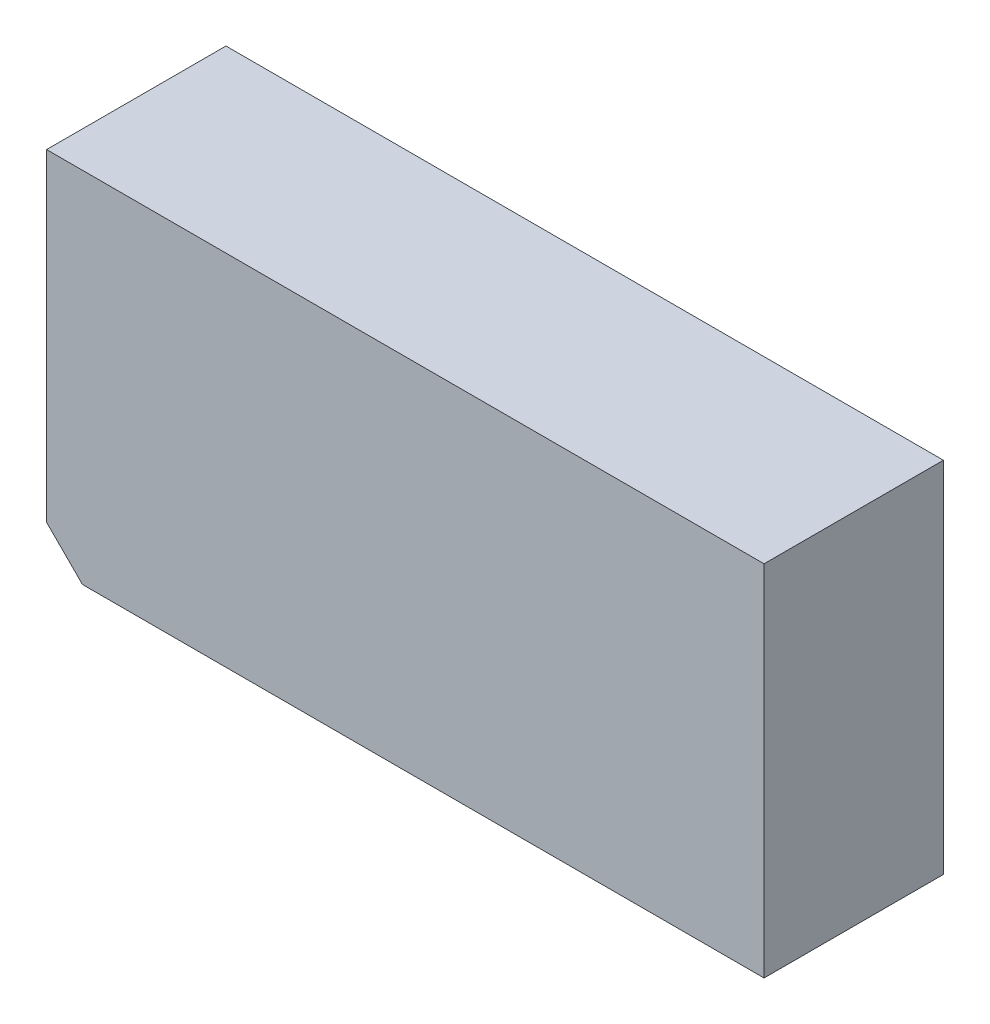
ISO-10303-21;
HEADER;
FILE_DESCRIPTION(('STEP AP214'),'2;1');
FILE_NAME('part.step','',(''),(''),'','','');
FILE_SCHEMA(('AUTOMOTIVE_DESIGN { 1 0 10303 214 1 1 1 1 }'));
ENDSEC;
DATA;
#1=APPLICATION_CONTEXT('core data for automotive mechanical design processes');
#2=APPLICATION_PROTOCOL_DEFINITION('international standard','automotive_design',2000,#1);
#3=PRODUCT_CONTEXT('',#1,'mechanical');
#4=PRODUCT('Part','Part','',(#3));
#5=PRODUCT_RELATED_PRODUCT_CATEGORY('part','',(#4));
#6=PRODUCT_DEFINITION_FORMATION('','',#4);
#7=PRODUCT_DEFINITION_CONTEXT('part definition',#1,'design');
#8=PRODUCT_DEFINITION('design','',#6,#7);
#9=PRODUCT_DEFINITION_SHAPE('','',#8);
#10=(LENGTH_UNIT() NAMED_UNIT(*) SI_UNIT(.MILLI.,.METRE.));
#11=(NAMED_UNIT(*) PLANE_ANGLE_UNIT() SI_UNIT($,.RADIAN.));
#12=(NAMED_UNIT(*) SI_UNIT($,.STERADIAN.) SOLID_ANGLE_UNIT());
#13=UNCERTAINTY_MEASURE_WITH_UNIT(LENGTH_MEASURE(1.E-05),#10,'distance_accuracy_value','');
#14=(GEOMETRIC_REPRESENTATION_CONTEXT(3) GLOBAL_UNCERTAINTY_ASSIGNED_CONTEXT((#13)) GLOBAL_UNIT_ASSIGNED_CONTEXT((#10,
#11,#12)) REPRESENTATION_CONTEXT('',''));
#15=CARTESIAN_POINT('',(0.,0.,0.));
#16=DIRECTION('',(0.,0.,1.));
#17=DIRECTION('',(1.,0.,0.));
#18=AXIS2_PLACEMENT_3D('',#15,#16,#17);
#19=CARTESIAN_POINT('',(0.,20.,10.));
#20=DIRECTION('',(1.,0.,0.));
#21=DIRECTION('',(0.,0.,-1.));
#22=AXIS2_PLACEMENT_3D('',#19,#20,#21);
#23=PLANE('',#22);
#24=DIRECTION('',(0.,-1.,0.));
#25=VECTOR('',#24,1.);
#26=CARTESIAN_POINT('',(0.,20.,0.));
#27=LINE('',#26,#25);
#28=CARTESIAN_POINT('',(0.,20.,0.));
#29=VERTEX_POINT('',#28);
#30=CARTESIAN_POINT('',(0.,2.00000000000001,0.));
#31=VERTEX_POINT('',#30);
#32=EDGE_CURVE('E120',#29,#31,#27,.T.);
#33=ORIENTED_EDGE('',*,*,#32,.T.);
#34=DIRECTION('',(0.,0.,1.));
#35=VECTOR('',#34,1.);
#36=CARTESIAN_POINT('',(0.,2.00000000000001,10.));
#37=LINE('',#36,#35);
#38=CARTESIAN_POINT('',(0.,2.00000000000001,10.));
#39=VERTEX_POINT('',#38);
#40=EDGE_CURVE('E52',#31,#39,#37,.T.);
#41=ORIENTED_EDGE('',*,*,#40,.T.);
#42=DIRECTION('',(0.,-1.,0.));
#43=VECTOR('',#42,1.);
#44=CARTESIAN_POINT('',(0.,20.,10.));
#45=LINE('',#44,#43);
#46=CARTESIAN_POINT('',(0.,20.,10.));
#47=VERTEX_POINT('',#46);
#48=EDGE_CURVE('E100',#47,#39,#45,.T.);
#49=ORIENTED_EDGE('',*,*,#48,.F.);
#50=DIRECTION('',(0.,0.,-1.));
#51=VECTOR('',#50,1.);
#52=CARTESIAN_POINT('',(0.,20.,10.));
#53=LINE('',#52,#51);
#54=EDGE_CURVE('E116',#47,#29,#53,.T.);
#55=ORIENTED_EDGE('',*,*,#54,.T.);
#56=EDGE_LOOP('',(#33,#41,#49,#55));
#57=FACE_BOUND('',#56,.T.);
#58=ADVANCED_FACE('F43',(#57),#23,.F.);
#59=CARTESIAN_POINT('',(0.,0.,10.));
#60=DIRECTION('',(0.,1.,0.));
#61=DIRECTION('',(0.,0.,1.));
#62=AXIS2_PLACEMENT_3D('',#59,#60,#61);
#63=PLANE('',#62);
#64=DIRECTION('',(1.,0.,0.));
#65=VECTOR('',#64,1.);
#66=CARTESIAN_POINT('',(0.,0.,10.));
#67=LINE('',#66,#65);
#68=CARTESIAN_POINT('',(1.99999999999999,0.,10.));
#69=VERTEX_POINT('',#68);
#70=CARTESIAN_POINT('',(40.,0.,10.));
#71=VERTEX_POINT('',#70);
#72=EDGE_CURVE('E90',#69,#71,#67,.T.);
#73=ORIENTED_EDGE('',*,*,#72,.F.);
#74=DIRECTION('',(0.,0.,-1.));
#75=VECTOR('',#74,1.);
#76=CARTESIAN_POINT('',(1.99999999999999,0.,10.));
#77=LINE('',#76,#75);
#78=CARTESIAN_POINT('',(1.99999999999999,0.,0.));
#79=VERTEX_POINT('',#78);
#80=EDGE_CURVE('E108',#69,#79,#77,.T.);
#81=ORIENTED_EDGE('',*,*,#80,.T.);
#82=DIRECTION('',(1.,0.,0.));
#83=VECTOR('',#82,1.);
#84=CARTESIAN_POINT('',(0.,0.,0.));
#85=LINE('',#84,#83);
#86=CARTESIAN_POINT('',(40.,0.,0.));
#87=VERTEX_POINT('',#86);
#88=EDGE_CURVE('E105',#79,#87,#85,.T.);
#89=ORIENTED_EDGE('',*,*,#88,.T.);
#90=DIRECTION('',(0.,0.,-1.));
#91=VECTOR('',#90,1.);
#92=CARTESIAN_POINT('',(40.,0.,10.));
#93=LINE('',#92,#91);
#94=EDGE_CURVE('E103',#71,#87,#93,.T.);
#95=ORIENTED_EDGE('',*,*,#94,.F.);
#96=EDGE_LOOP('',(#73,#81,#89,#95));
#97=FACE_BOUND('',#96,.T.);
#98=ADVANCED_FACE('F104',(#97),#63,.F.);
#99=CARTESIAN_POINT('',(40.,0.,10.));
#100=DIRECTION('',(-1.,0.,0.));
#101=DIRECTION('',(0.,0.,1.));
#102=AXIS2_PLACEMENT_3D('',#99,#100,#101);
#103=PLANE('',#102);
#104=DIRECTION('',(0.,1.,0.));
#105=VECTOR('',#104,1.);
#106=CARTESIAN_POINT('',(40.,0.,0.));
#107=LINE('',#106,#105);
#108=CARTESIAN_POINT('',(40.,20.,0.));
#109=VERTEX_POINT('',#108);
#110=EDGE_CURVE('E123',#87,#109,#107,.T.);
#111=ORIENTED_EDGE('',*,*,#110,.T.);
#112=DIRECTION('',(0.,0.,-1.));
#113=VECTOR('',#112,1.);
#114=CARTESIAN_POINT('',(40.,20.,10.));
#115=LINE('',#114,#113);
#116=CARTESIAN_POINT('',(40.,20.,10.));
#117=VERTEX_POINT('',#116);
#118=EDGE_CURVE('E109',#117,#109,#115,.T.);
#119=ORIENTED_EDGE('',*,*,#118,.F.);
#120=DIRECTION('',(0.,1.,0.));
#121=VECTOR('',#120,1.);
#122=CARTESIAN_POINT('',(40.,0.,10.));
#123=LINE('',#122,#121);
#124=EDGE_CURVE('E94',#71,#117,#123,.T.);
#125=ORIENTED_EDGE('',*,*,#124,.F.);
#126=ORIENTED_EDGE('',*,*,#94,.T.);
#127=EDGE_LOOP('',(#111,#119,#125,#126));
#128=FACE_BOUND('',#127,.T.);
#129=ADVANCED_FACE('F111',(#128),#103,.F.);
#130=CARTESIAN_POINT('',(40.,20.,10.));
#131=DIRECTION('',(0.,-1.,0.));
#132=DIRECTION('',(0.,0.,-1.));
#133=AXIS2_PLACEMENT_3D('',#130,#131,#132);
#134=PLANE('',#133);
#135=DIRECTION('',(-1.,0.,0.));
#136=VECTOR('',#135,1.);
#137=CARTESIAN_POINT('',(40.,20.,0.));
#138=LINE('',#137,#136);
#139=EDGE_CURVE('E125',#109,#29,#138,.T.);
#140=ORIENTED_EDGE('',*,*,#139,.T.);
#141=ORIENTED_EDGE('',*,*,#54,.F.);
#142=DIRECTION('',(-1.,0.,0.));
#143=VECTOR('',#142,1.);
#144=CARTESIAN_POINT('',(40.,20.,10.));
#145=LINE('',#144,#143);
#146=EDGE_CURVE('E114',#117,#47,#145,.T.);
#147=ORIENTED_EDGE('',*,*,#146,.F.);
#148=ORIENTED_EDGE('',*,*,#118,.T.);
#149=EDGE_LOOP('',(#140,#141,#147,#148));
#150=FACE_BOUND('',#149,.T.);
#151=ADVANCED_FACE('F135',(#150),#134,.F.);
#152=CARTESIAN_POINT('',(0.,0.,10.));
#153=DIRECTION('',(0.,0.,1.));
#154=DIRECTION('',(1.,0.,0.));
#155=AXIS2_PLACEMENT_3D('',#152,#153,#154);
#156=PLANE('',#155);
#157=ORIENTED_EDGE('',*,*,#48,.T.);
#158=DIRECTION('',(-0.707106781186544,0.707106781186551,0.));
#159=VECTOR('',#158,1.);
#160=CARTESIAN_POINT('',(1.,0.999999999999994,10.));
#161=LINE('',#160,#159);
#162=EDGE_CURVE('E11',#39,#69,#161,.F.);
#163=ORIENTED_EDGE('',*,*,#162,.T.);
#164=ORIENTED_EDGE('',*,*,#72,.T.);
#165=ORIENTED_EDGE('',*,*,#124,.T.);
#166=ORIENTED_EDGE('',*,*,#146,.T.);
#167=EDGE_LOOP('',(#157,#163,#164,#165,#166));
#168=FACE_BOUND('',#167,.T.);
#169=ADVANCED_FACE('F92',(#168),#156,.T.);
#170=CARTESIAN_POINT('',(0.,0.,0.));
#171=DIRECTION('',(0.,0.,1.));
#172=DIRECTION('',(1.,0.,0.));
#173=AXIS2_PLACEMENT_3D('',#170,#171,#172);
#174=PLANE('',#173);
#175=ORIENTED_EDGE('',*,*,#88,.F.);
#176=DIRECTION('',(0.707106781186544,-0.707106781186551,0.));
#177=VECTOR('',#176,1.);
#178=CARTESIAN_POINT('',(1.99999999999999,0.,0.));
#179=LINE('',#178,#177);
#180=EDGE_CURVE('E66',#79,#31,#179,.F.);
#181=ORIENTED_EDGE('',*,*,#180,.T.);
#182=ORIENTED_EDGE('',*,*,#32,.F.);
#183=ORIENTED_EDGE('',*,*,#139,.F.);
#184=ORIENTED_EDGE('',*,*,#110,.F.);
#185=EDGE_LOOP('',(#175,#181,#182,#183,#184));
#186=FACE_BOUND('',#185,.T.);
#187=ADVANCED_FACE('F132',(#186),#174,.F.);
#188=CARTESIAN_POINT('',(1.99999999999999,0.,10.));
#189=DIRECTION('',(0.707106781186551,0.707106781186544,0.));
#190=DIRECTION('',(0.,0.,-1.));
#191=AXIS2_PLACEMENT_3D('',#188,#189,#190);
#192=PLANE('',#191);
#193=ORIENTED_EDGE('',*,*,#162,.F.);
#194=ORIENTED_EDGE('',*,*,#40,.F.);
#195=ORIENTED_EDGE('',*,*,#180,.F.);
#196=ORIENTED_EDGE('',*,*,#80,.F.);
#197=EDGE_LOOP('',(#193,#194,#195,#196));
#198=FACE_BOUND('',#197,.T.);
#199=ADVANCED_FACE('F46',(#198),#192,.F.);
#200=CLOSED_SHELL('',(#58,#98,#129,#151,#169,#187,#199));
#201=MANIFOLD_SOLID_BREP('B2',#200);
#202=ADVANCED_BREP_SHAPE_REPRESENTATION('',(#18,#201),#14);
#203=SHAPE_DEFINITION_REPRESENTATION(#9,#202);
ENDSEC;
END-ISO-10303-21;
